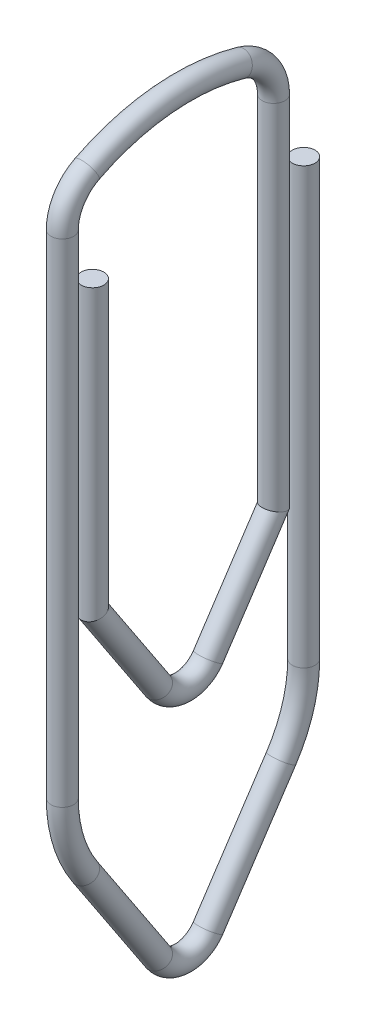
ISO-10303-21;
HEADER;
FILE_DESCRIPTION(('STEP AP214'),'2;1');
FILE_NAME('part.step','',(''),(''),'','','');
FILE_SCHEMA(('AUTOMOTIVE_DESIGN { 1 0 10303 214 1 1 1 1 }'));
ENDSEC;
DATA;
#1=APPLICATION_CONTEXT('core data for automotive mechanical design processes');
#2=APPLICATION_PROTOCOL_DEFINITION('international standard','automotive_design',2000,#1);
#3=PRODUCT_CONTEXT('',#1,'mechanical');
#4=PRODUCT('Part','Part','',(#3));
#5=PRODUCT_RELATED_PRODUCT_CATEGORY('part','',(#4));
#6=PRODUCT_DEFINITION_FORMATION('','',#4);
#7=PRODUCT_DEFINITION_CONTEXT('part definition',#1,'design');
#8=PRODUCT_DEFINITION('design','',#6,#7);
#9=PRODUCT_DEFINITION_SHAPE('','',#8);
#10=(LENGTH_UNIT() NAMED_UNIT(*) SI_UNIT(.MILLI.,.METRE.));
#11=(NAMED_UNIT(*) PLANE_ANGLE_UNIT() SI_UNIT($,.RADIAN.));
#12=(NAMED_UNIT(*) SI_UNIT($,.STERADIAN.) SOLID_ANGLE_UNIT());
#13=UNCERTAINTY_MEASURE_WITH_UNIT(LENGTH_MEASURE(1.E-05),#10,'distance_accuracy_value','');
#14=(GEOMETRIC_REPRESENTATION_CONTEXT(3) GLOBAL_UNCERTAINTY_ASSIGNED_CONTEXT((#13)) GLOBAL_UNIT_ASSIGNED_CONTEXT((#10,
#11,#12)) REPRESENTATION_CONTEXT('',''));
#15=CARTESIAN_POINT('',(0.,0.,0.));
#16=DIRECTION('',(0.,0.,1.));
#17=DIRECTION('',(1.,0.,0.));
#18=AXIS2_PLACEMENT_3D('',#15,#16,#17);
#19=CARTESIAN_POINT('',(0.,0.,-14.));
#20=DIRECTION('',(0.,-1.,0.));
#21=DIRECTION('',(0.,0.,-1.));
#22=AXIS2_PLACEMENT_3D('',#19,#20,#21);
#23=PLANE('',#22);
#24=CARTESIAN_POINT('',(0.,0.,-14.));
#25=DIRECTION('',(0.,-1.,0.));
#26=DIRECTION('',(0.,0.,-1.));
#27=AXIS2_PLACEMENT_3D('',#24,#25,#26);
#28=CIRCLE('',#27,0.75);
#29=CARTESIAN_POINT('',(0.,0.,-14.75));
#30=VERTEX_POINT('',#29);
#31=EDGE_CURVE('E65',#30,#30,#28,.T.);
#32=ORIENTED_EDGE('',*,*,#31,.F.);
#33=EDGE_LOOP('',(#32));
#34=FACE_BOUND('',#33,.T.);
#35=ADVANCED_FACE('F37',(#34),#23,.F.);
#36=CARTESIAN_POINT('',(0.,0.,0.));
#37=DIRECTION('',(0.,1.,0.));
#38=DIRECTION('',(0.,0.,1.));
#39=AXIS2_PLACEMENT_3D('',#36,#37,#38);
#40=PLANE('',#39);
#41=CARTESIAN_POINT('',(0.,0.,0.));
#42=DIRECTION('',(0.,1.,0.));
#43=DIRECTION('',(0.,0.,1.));
#44=AXIS2_PLACEMENT_3D('',#41,#42,#43);
#45=CIRCLE('',#44,0.75);
#46=CARTESIAN_POINT('',(0.,0.,0.750000000000002));
#47=VERTEX_POINT('',#46);
#48=EDGE_CURVE('E45',#47,#47,#45,.T.);
#49=ORIENTED_EDGE('',*,*,#48,.T.);
#50=EDGE_LOOP('',(#49));
#51=FACE_BOUND('',#50,.T.);
#52=ADVANCED_FACE('F122',(#51),#40,.T.);
#53=CARTESIAN_POINT('',(0.,-19.3482968172845,-12.));
#54=DIRECTION('',(0.,1.,0.));
#55=DIRECTION('',(0.,0.,1.));
#56=AXIS2_PLACEMENT_3D('',#53,#54,#55);
#57=CYLINDRICAL_SURFACE('',#56,0.75);
#58=CARTESIAN_POINT('',(0.,-19.,-12.));
#59=DIRECTION('',(0.,0.957571360804815,-0.288196268134088));
#60=DIRECTION('',(0.,-0.288196268134088,-0.957571360804815));
#61=AXIS2_PLACEMENT_3D('',#58,#59,#60);
#62=ELLIPSE('',#61,0.783231444359033,0.75);
#63=CARTESIAN_POINT('',(0.,-19.2257243793495,-12.75));
#64=VERTEX_POINT('',#63);
#65=EDGE_CURVE('E58',#64,#64,#62,.T.);
#66=ORIENTED_EDGE('',*,*,#65,.T.);
#67=EDGE_LOOP('',(#66));
#68=FACE_BOUND('',#67,.T.);
#69=CARTESIAN_POINT('',(0.,4.58300524425837,-12.));
#70=DIRECTION('',(0.,-1.,0.));
#71=DIRECTION('',(0.,0.,-1.));
#72=AXIS2_PLACEMENT_3D('',#69,#70,#71);
#73=CIRCLE('',#72,0.75);
#74=CARTESIAN_POINT('',(0.,4.58300524425837,-12.75));
#75=VERTEX_POINT('',#74);
#76=EDGE_CURVE('E40',#75,#75,#73,.T.);
#77=ORIENTED_EDGE('',*,*,#76,.T.);
#78=EDGE_LOOP('',(#77));
#79=FACE_BOUND('',#78,.T.);
#80=ADVANCED_FACE('F109',(#68,#79),#57,.T.);
#81=CARTESIAN_POINT('',(0.,4.58300524425836,-9.));
#82=DIRECTION('',(1.,0.,0.));
#83=DIRECTION('',(0.,0.,-1.));
#84=AXIS2_PLACEMENT_3D('',#81,#82,#83);
#85=TOROIDAL_SURFACE('',#84,3.,0.75);
#86=CARTESIAN_POINT('',(0.,7.46927940178337,-9.81818181818182));
#87=DIRECTION('',(0.,-0.272727272727273,-0.962091385841669));
#88=DIRECTION('',(0.,0.962091385841669,-0.272727272727273));
#89=AXIS2_PLACEMENT_3D('',#86,#87,#88);
#90=CIRCLE('',#89,0.75);
#91=CARTESIAN_POINT('',(0.,8.19084794116463,-10.0227272727273));
#92=VERTEX_POINT('',#91);
#93=EDGE_CURVE('E100',#92,#92,#90,.T.);
#94=CARTESIAN_POINT('',(0.,4.58300524425836,-9.));
#95=DIRECTION('',(1.,0.,0.));
#96=DIRECTION('',(0.,0.,-1.));
#97=AXIS2_PLACEMENT_3D('',#94,#95,#96);
#98=CIRCLE('',#97,3.75);
#99=EDGE_CURVE('',#75,#92,#98,.T.);
#100=ORIENTED_EDGE('',*,*,#76,.F.);
#101=ORIENTED_EDGE('',*,*,#93,.T.);
#102=ORIENTED_EDGE('',*,*,#99,.T.);
#103=ORIENTED_EDGE('',*,*,#99,.F.);
#104=EDGE_LOOP('',(#100,#102,#101,#103));
#105=FACE_BOUND('',#104,.T.);
#106=ADVANCED_FACE('F111',(#105),#85,.T.);
#107=CARTESIAN_POINT('',(0.,-6.,-6.00000000000001));
#108=DIRECTION('',(1.,0.,0.));
#109=DIRECTION('',(0.,0.,-1.));
#110=AXIS2_PLACEMENT_3D('',#107,#108,#109);
#111=TOROIDAL_SURFACE('',#110,14.,0.75);
#112=CARTESIAN_POINT('',(0.,6.47012959962345,0.363636363636361));
#113=DIRECTION('',(0.,0.454545454545455,-0.890723542830247));
#114=DIRECTION('',(0.,0.890723542830246,0.454545454545455));
#115=AXIS2_PLACEMENT_3D('',#112,#113,#114);
#116=CIRCLE('',#115,0.75);
#117=CARTESIAN_POINT('',(0.,7.13817225674614,0.704545454545452));
#118=VERTEX_POINT('',#117);
#119=EDGE_CURVE('E97',#118,#118,#116,.T.);
#120=CARTESIAN_POINT('',(0.,-6.,-6.00000000000001));
#121=DIRECTION('',(1.,0.,0.));
#122=DIRECTION('',(0.,0.,-1.));
#123=AXIS2_PLACEMENT_3D('',#120,#121,#122);
#124=CIRCLE('',#123,14.75);
#125=EDGE_CURVE('',#92,#118,#124,.T.);
#126=ORIENTED_EDGE('',*,*,#93,.F.);
#127=ORIENTED_EDGE('',*,*,#119,.T.);
#128=ORIENTED_EDGE('',*,*,#125,.T.);
#129=ORIENTED_EDGE('',*,*,#125,.F.);
#130=EDGE_LOOP('',(#126,#128,#127,#129));
#131=FACE_BOUND('',#130,.T.);
#132=ADVANCED_FACE('F113',(#131),#111,.T.);
#133=CARTESIAN_POINT('',(0.,3.79795897113271,-1.));
#134=DIRECTION('',(1.,0.,0.));
#135=DIRECTION('',(0.,0.,-1.));
#136=AXIS2_PLACEMENT_3D('',#133,#134,#135);
#137=TOROIDAL_SURFACE('',#136,3.,0.75);
#138=CARTESIAN_POINT('',(0.,3.79795897113271,2.));
#139=DIRECTION('',(0.,1.,0.));
#140=DIRECTION('',(0.,0.,1.));
#141=AXIS2_PLACEMENT_3D('',#138,#139,#140);
#142=CIRCLE('',#141,0.75);
#143=CARTESIAN_POINT('',(0.,3.79795897113271,2.75));
#144=VERTEX_POINT('',#143);
#145=EDGE_CURVE('E93',#144,#144,#142,.T.);
#146=CARTESIAN_POINT('',(0.,3.79795897113271,-1.));
#147=DIRECTION('',(1.,0.,0.));
#148=DIRECTION('',(0.,0.,-1.));
#149=AXIS2_PLACEMENT_3D('',#146,#147,#148);
#150=CIRCLE('',#149,3.75);
#151=EDGE_CURVE('',#118,#144,#150,.T.);
#152=ORIENTED_EDGE('',*,*,#119,.F.);
#153=ORIENTED_EDGE('',*,*,#145,.T.);
#154=ORIENTED_EDGE('',*,*,#151,.T.);
#155=ORIENTED_EDGE('',*,*,#151,.F.);
#156=EDGE_LOOP('',(#152,#154,#153,#155));
#157=FACE_BOUND('',#156,.T.);
#158=ADVANCED_FACE('F119',(#157),#137,.T.);
#159=CARTESIAN_POINT('',(0.,3.79795897113271,2.));
#160=DIRECTION('',(0.,-1.,0.));
#161=DIRECTION('',(0.,0.,-1.));
#162=AXIS2_PLACEMENT_3D('',#159,#160,#161);
#163=CYLINDRICAL_SURFACE('',#162,0.75);
#164=CARTESIAN_POINT('',(0.,-28.8282279643815,2.));
#165=DIRECTION('',(0.,1.,0.));
#166=DIRECTION('',(0.,0.,1.));
#167=AXIS2_PLACEMENT_3D('',#164,#165,#166);
#168=CIRCLE('',#167,0.75);
#169=CARTESIAN_POINT('',(0.,-28.8282279643815,2.75));
#170=VERTEX_POINT('',#169);
#171=EDGE_CURVE('E89',#170,#170,#168,.T.);
#172=ORIENTED_EDGE('',*,*,#171,.T.);
#173=EDGE_LOOP('',(#172));
#174=FACE_BOUND('',#173,.T.);
#175=ORIENTED_EDGE('',*,*,#145,.F.);
#176=EDGE_LOOP('',(#175));
#177=FACE_BOUND('',#176,.T.);
#178=ADVANCED_FACE('F168',(#174,#177),#163,.T.);
#179=CARTESIAN_POINT('',(0.,-28.8282279643815,-7.00000000000001));
#180=DIRECTION('',(1.,0.,0.));
#181=DIRECTION('',(0.,0.,-1.));
#182=AXIS2_PLACEMENT_3D('',#179,#180,#181);
#183=TOROIDAL_SURFACE('',#182,9.00000000000001,0.75);
#184=CARTESIAN_POINT('',(0.,-33.79566083219,0.504972398604524));
#185=DIRECTION('',(0.,0.833885822067169,0.551936985312056));
#186=DIRECTION('',(0.,-0.551936985312056,0.833885822067169));
#187=AXIS2_PLACEMENT_3D('',#184,#185,#186);
#188=CIRCLE('',#187,0.75);
#189=CARTESIAN_POINT('',(0.,-34.209613571174,1.1303867651549));
#190=VERTEX_POINT('',#189);
#191=EDGE_CURVE('E85',#190,#190,#188,.T.);
#192=CARTESIAN_POINT('',(0.,-28.8282279643815,-7.00000000000001));
#193=DIRECTION('',(1.,0.,0.));
#194=DIRECTION('',(0.,0.,-1.));
#195=AXIS2_PLACEMENT_3D('',#192,#193,#194);
#196=CIRCLE('',#195,9.75000000000001);
#197=EDGE_CURVE('',#170,#190,#196,.T.);
#198=ORIENTED_EDGE('',*,*,#171,.F.);
#199=ORIENTED_EDGE('',*,*,#191,.T.);
#200=ORIENTED_EDGE('',*,*,#197,.T.);
#201=ORIENTED_EDGE('',*,*,#197,.F.);
#202=EDGE_LOOP('',(#198,#200,#199,#201));
#203=FACE_BOUND('',#202,.T.);
#204=ADVANCED_FACE('F164',(#203),#183,.T.);
#205=CARTESIAN_POINT('',(0.,-33.79566083219,0.504972398604522));
#206=DIRECTION('',(0.,-0.833885822067169,-0.551936985312058));
#207=DIRECTION('',(0.,0.551936985312058,-0.833885822067169));
#208=AXIS2_PLACEMENT_3D('',#205,#206,#207);
#209=CYLINDRICAL_SURFACE('',#208,0.75);
#210=CARTESIAN_POINT('',(0.,-41.1038739706241,-4.33222835586567));
#211=DIRECTION('',(0.,0.833885822067169,0.551936985312058));
#212=DIRECTION('',(0.,-0.551936985312058,0.833885822067169));
#213=AXIS2_PLACEMENT_3D('',#210,#211,#212);
#214=CIRCLE('',#213,0.75);
#215=CARTESIAN_POINT('',(0.,-41.5178267096082,-3.70681398931529));
#216=VERTEX_POINT('',#215);
#217=EDGE_CURVE('E81',#216,#216,#214,.T.);
#218=ORIENTED_EDGE('',*,*,#217,.T.);
#219=EDGE_LOOP('',(#218));
#220=FACE_BOUND('',#219,.T.);
#221=ORIENTED_EDGE('',*,*,#191,.F.);
#222=EDGE_LOOP('',(#221));
#223=FACE_BOUND('',#222,.T.);
#224=ADVANCED_FACE('F160',(#220,#223),#209,.T.);
#225=CARTESIAN_POINT('',(0.,-40.,-6.));
#226=DIRECTION('',(1.,0.,0.));
#227=DIRECTION('',(0.,0.,-1.));
#228=AXIS2_PLACEMENT_3D('',#225,#226,#227);
#229=TOROIDAL_SURFACE('',#228,2.,0.75);
#230=CARTESIAN_POINT('',(0.,-41.1038739706241,-7.66777164413434));
#231=DIRECTION('',(0.,-0.833885822067169,0.551936985312058));
#232=DIRECTION('',(0.,-0.551936985312058,-0.833885822067168));
#233=AXIS2_PLACEMENT_3D('',#230,#231,#232);
#234=CIRCLE('',#233,0.75);
#235=CARTESIAN_POINT('',(0.,-41.5178267096082,-8.29318601068471));
#236=VERTEX_POINT('',#235);
#237=EDGE_CURVE('E77',#236,#236,#234,.T.);
#238=CARTESIAN_POINT('',(0.,-40.,-6.));
#239=DIRECTION('',(1.,0.,0.));
#240=DIRECTION('',(0.,0.,-1.));
#241=AXIS2_PLACEMENT_3D('',#238,#239,#240);
#242=CIRCLE('',#241,2.75);
#243=EDGE_CURVE('',#216,#236,#242,.T.);
#244=ORIENTED_EDGE('',*,*,#217,.F.);
#245=ORIENTED_EDGE('',*,*,#237,.T.);
#246=ORIENTED_EDGE('',*,*,#243,.T.);
#247=ORIENTED_EDGE('',*,*,#243,.F.);
#248=EDGE_LOOP('',(#244,#246,#245,#247));
#249=FACE_BOUND('',#248,.T.);
#250=ADVANCED_FACE('F156',(#249),#229,.T.);
#251=CARTESIAN_POINT('',(0.,-41.1038739706241,-7.66777164413434));
#252=DIRECTION('',(0.,0.833885822067169,-0.551936985312057));
#253=DIRECTION('',(0.,0.551936985312057,0.833885822067169));
#254=AXIS2_PLACEMENT_3D('',#251,#252,#253);
#255=CYLINDRICAL_SURFACE('',#254,0.75);
#256=CARTESIAN_POINT('',(0.,-33.79566083219,-12.5049723986045));
#257=DIRECTION('',(0.,-0.833885822067169,0.551936985312057));
#258=DIRECTION('',(0.,-0.551936985312057,-0.833885822067169));
#259=AXIS2_PLACEMENT_3D('',#256,#257,#258);
#260=CIRCLE('',#259,0.75);
#261=CARTESIAN_POINT('',(0.,-34.209613571174,-13.1303867651549));
#262=VERTEX_POINT('',#261);
#263=EDGE_CURVE('E73',#262,#262,#260,.T.);
#264=ORIENTED_EDGE('',*,*,#263,.T.);
#265=EDGE_LOOP('',(#264));
#266=FACE_BOUND('',#265,.T.);
#267=ORIENTED_EDGE('',*,*,#237,.F.);
#268=EDGE_LOOP('',(#267));
#269=FACE_BOUND('',#268,.T.);
#270=ADVANCED_FACE('F152',(#266,#269),#255,.T.);
#271=CARTESIAN_POINT('',(0.,-28.8282279643815,-4.99999999999999));
#272=DIRECTION('',(1.,0.,0.));
#273=DIRECTION('',(0.,0.,-1.));
#274=AXIS2_PLACEMENT_3D('',#271,#272,#273);
#275=TOROIDAL_SURFACE('',#274,9.00000000000001,0.75);
#276=CARTESIAN_POINT('',(0.,-28.8282279643815,-14.));
#277=DIRECTION('',(0.,-1.,0.));
#278=DIRECTION('',(0.,0.,-1.));
#279=AXIS2_PLACEMENT_3D('',#276,#277,#278);
#280=CIRCLE('',#279,0.75);
#281=CARTESIAN_POINT('',(0.,-28.8282279643815,-14.75));
#282=VERTEX_POINT('',#281);
#283=EDGE_CURVE('E69',#282,#282,#280,.T.);
#284=CARTESIAN_POINT('',(0.,-28.8282279643815,-4.99999999999999));
#285=DIRECTION('',(1.,0.,0.));
#286=DIRECTION('',(0.,0.,-1.));
#287=AXIS2_PLACEMENT_3D('',#284,#285,#286);
#288=CIRCLE('',#287,9.75000000000001);
#289=EDGE_CURVE('',#262,#282,#288,.T.);
#290=ORIENTED_EDGE('',*,*,#263,.F.);
#291=ORIENTED_EDGE('',*,*,#283,.T.);
#292=ORIENTED_EDGE('',*,*,#289,.T.);
#293=ORIENTED_EDGE('',*,*,#289,.F.);
#294=EDGE_LOOP('',(#290,#292,#291,#293));
#295=FACE_BOUND('',#294,.T.);
#296=ADVANCED_FACE('F148',(#295),#275,.T.);
#297=CARTESIAN_POINT('',(0.,-28.8282279643815,-14.));
#298=DIRECTION('',(0.,1.,0.));
#299=DIRECTION('',(0.,0.,1.));
#300=AXIS2_PLACEMENT_3D('',#297,#298,#299);
#301=CYLINDRICAL_SURFACE('',#300,0.75);
#302=ORIENTED_EDGE('',*,*,#31,.T.);
#303=EDGE_LOOP('',(#302));
#304=FACE_BOUND('',#303,.T.);
#305=ORIENTED_EDGE('',*,*,#283,.F.);
#306=EDGE_LOOP('',(#305));
#307=FACE_BOUND('',#306,.T.);
#308=ADVANCED_FACE('F142',(#304,#307),#301,.T.);
#309=CARTESIAN_POINT('',(0.,-18.7095602221953,0.192237895325792));
#310=DIRECTION('',(0.,-0.833885822067169,-0.551936985312056));
#311=DIRECTION('',(0.,0.551936985312056,-0.83388582206717));
#312=AXIS2_PLACEMENT_3D('',#309,#310,#311);
#313=CYLINDRICAL_SURFACE('',#312,0.75);
#314=CARTESIAN_POINT('',(0.,-19.,0.));
#315=DIRECTION('',(0.,-0.957571360804815,-0.288196268134088));
#316=DIRECTION('',(0.,-0.288196268134088,0.957571360804815));
#317=AXIS2_PLACEMENT_3D('',#314,#315,#316);
#318=ELLIPSE('',#317,0.783231444359033,0.75);
#319=CARTESIAN_POINT('',(0.,-19.2257243793495,0.750000000000002));
#320=VERTEX_POINT('',#319);
#321=EDGE_CURVE('E10',#320,#320,#318,.T.);
#322=ORIENTED_EDGE('',*,*,#321,.T.);
#323=EDGE_LOOP('',(#322));
#324=FACE_BOUND('',#323,.T.);
#325=CARTESIAN_POINT('',(0.,-25.5452830668183,-4.33222835586566));
#326=DIRECTION('',(0.,0.83388582206717,0.551936985312056));
#327=DIRECTION('',(0.,-0.551936985312056,0.83388582206717));
#328=AXIS2_PLACEMENT_3D('',#325,#326,#327);
#329=CIRCLE('',#328,0.75);
#330=CARTESIAN_POINT('',(0.,-25.9592358058023,-3.70681398931528));
#331=VERTEX_POINT('',#330);
#332=EDGE_CURVE('E54',#331,#331,#329,.T.);
#333=ORIENTED_EDGE('',*,*,#332,.T.);
#334=EDGE_LOOP('',(#333));
#335=FACE_BOUND('',#334,.T.);
#336=ADVANCED_FACE('F139',(#324,#335),#313,.T.);
#337=CARTESIAN_POINT('',(0.,-24.4414090961942,-6.));
#338=DIRECTION('',(1.,0.,0.));
#339=DIRECTION('',(0.,0.,-1.));
#340=AXIS2_PLACEMENT_3D('',#337,#338,#339);
#341=TOROIDAL_SURFACE('',#340,2.,0.75);
#342=CARTESIAN_POINT('',(0.,-25.5452830668183,-7.66777164413434));
#343=DIRECTION('',(0.,-0.83388582206717,0.551936985312055));
#344=DIRECTION('',(0.,-0.551936985312055,-0.83388582206717));
#345=AXIS2_PLACEMENT_3D('',#342,#343,#344);
#346=CIRCLE('',#345,0.75);
#347=CARTESIAN_POINT('',(0.,-25.9592358058023,-8.29318601068472));
#348=VERTEX_POINT('',#347);
#349=EDGE_CURVE('E51',#348,#348,#346,.T.);
#350=CARTESIAN_POINT('',(0.,-24.4414090961942,-6.));
#351=DIRECTION('',(1.,0.,0.));
#352=DIRECTION('',(0.,0.,-1.));
#353=AXIS2_PLACEMENT_3D('',#350,#351,#352);
#354=CIRCLE('',#353,2.75);
#355=EDGE_CURVE('',#331,#348,#354,.T.);
#356=ORIENTED_EDGE('',*,*,#332,.F.);
#357=ORIENTED_EDGE('',*,*,#349,.T.);
#358=ORIENTED_EDGE('',*,*,#355,.T.);
#359=ORIENTED_EDGE('',*,*,#355,.F.);
#360=EDGE_LOOP('',(#356,#358,#357,#359));
#361=FACE_BOUND('',#360,.T.);
#362=ADVANCED_FACE('F133',(#361),#341,.T.);
#363=CARTESIAN_POINT('',(0.,-25.5452830668183,-7.66777164413435));
#364=DIRECTION('',(0.,0.833885822067169,-0.551936985312056));
#365=DIRECTION('',(0.,0.551936985312056,0.83388582206717));
#366=AXIS2_PLACEMENT_3D('',#363,#364,#365);
#367=CYLINDRICAL_SURFACE('',#366,0.75);
#368=ORIENTED_EDGE('',*,*,#349,.F.);
#369=EDGE_LOOP('',(#368));
#370=FACE_BOUND('',#369,.T.);
#371=ORIENTED_EDGE('',*,*,#65,.F.);
#372=EDGE_LOOP('',(#371));
#373=FACE_BOUND('',#372,.T.);
#374=ADVANCED_FACE('F127',(#370,#373),#367,.T.);
#375=CARTESIAN_POINT('',(0.,0.,0.));
#376=DIRECTION('',(0.,-1.,0.));
#377=DIRECTION('',(0.,0.,-1.));
#378=AXIS2_PLACEMENT_3D('',#375,#376,#377);
#379=CYLINDRICAL_SURFACE('',#378,0.75);
#380=ORIENTED_EDGE('',*,*,#48,.F.);
#381=EDGE_LOOP('',(#380));
#382=FACE_BOUND('',#381,.T.);
#383=ORIENTED_EDGE('',*,*,#321,.F.);
#384=EDGE_LOOP('',(#383));
#385=FACE_BOUND('',#384,.T.);
#386=ADVANCED_FACE('F125',(#382,#385),#379,.T.);
#387=CLOSED_SHELL('',(#35,#52,#80,#106,#132,#158,#178,#204,#224,#250,#270,#296,#308,#336,#362,
#374,#386));
#388=MANIFOLD_SOLID_BREP('B2',#387);
#389=ADVANCED_BREP_SHAPE_REPRESENTATION('',(#18,#388),#14);
#390=SHAPE_DEFINITION_REPRESENTATION(#9,#389);
ENDSEC;
END-ISO-10303-21;
